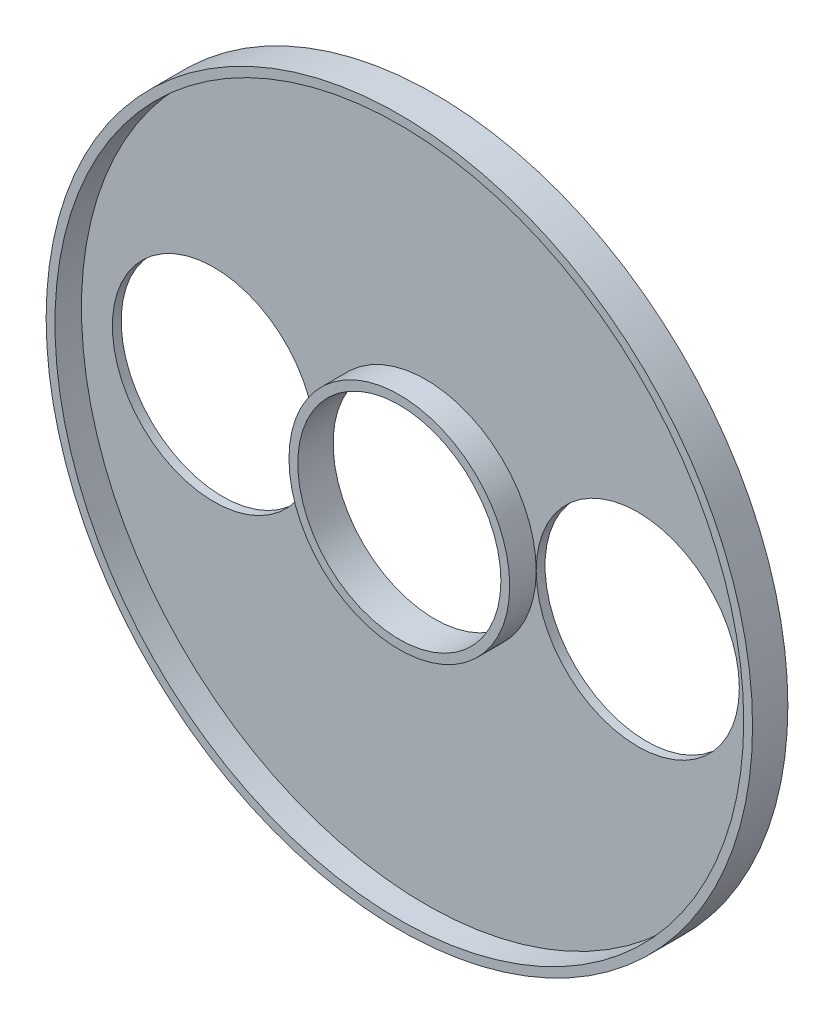
ISO-10303-21;
HEADER;
FILE_DESCRIPTION(('STEP AP214'),'2;1');
FILE_NAME('part.step','',(''),(''),'','','');
FILE_SCHEMA(('AUTOMOTIVE_DESIGN { 1 0 10303 214 1 1 1 1 }'));
ENDSEC;
DATA;
#1=APPLICATION_CONTEXT('core data for automotive mechanical design processes');
#2=APPLICATION_PROTOCOL_DEFINITION('international standard','automotive_design',2000,#1);
#3=PRODUCT_CONTEXT('',#1,'mechanical');
#4=PRODUCT('Part','Part','',(#3));
#5=PRODUCT_RELATED_PRODUCT_CATEGORY('part','',(#4));
#6=PRODUCT_DEFINITION_FORMATION('','',#4);
#7=PRODUCT_DEFINITION_CONTEXT('part definition',#1,'design');
#8=PRODUCT_DEFINITION('design','',#6,#7);
#9=PRODUCT_DEFINITION_SHAPE('','',#8);
#10=(LENGTH_UNIT() NAMED_UNIT(*) SI_UNIT(.MILLI.,.METRE.));
#11=(NAMED_UNIT(*) PLANE_ANGLE_UNIT() SI_UNIT($,.RADIAN.));
#12=(NAMED_UNIT(*) SI_UNIT($,.STERADIAN.) SOLID_ANGLE_UNIT());
#13=UNCERTAINTY_MEASURE_WITH_UNIT(LENGTH_MEASURE(1.E-05),#10,'distance_accuracy_value','');
#14=(GEOMETRIC_REPRESENTATION_CONTEXT(3) GLOBAL_UNCERTAINTY_ASSIGNED_CONTEXT((#13)) GLOBAL_UNIT_ASSIGNED_CONTEXT((#10,
#11,#12)) REPRESENTATION_CONTEXT('',''));
#15=CARTESIAN_POINT('',(0.,0.,0.));
#16=DIRECTION('',(0.,0.,1.));
#17=DIRECTION('',(1.,0.,0.));
#18=AXIS2_PLACEMENT_3D('',#15,#16,#17);
#19=CARTESIAN_POINT('',(0.,0.,-50.));
#20=DIRECTION('',(0.,0.,1.));
#21=DIRECTION('',(1.,0.,0.));
#22=AXIS2_PLACEMENT_3D('',#19,#20,#21);
#23=PLANE('',#22);
#24=CARTESIAN_POINT('',(0.,0.,-50.));
#25=DIRECTION('',(0.,0.,1.));
#26=DIRECTION('',(1.,0.,0.));
#27=AXIS2_PLACEMENT_3D('',#24,#25,#26);
#28=CIRCLE('',#27,78.);
#29=CARTESIAN_POINT('',(78.,0.,-50.));
#30=VERTEX_POINT('',#29);
#31=EDGE_CURVE('E11',#30,#30,#28,.F.);
#32=ORIENTED_EDGE('',*,*,#31,.F.);
#33=EDGE_LOOP('',(#32));
#34=FACE_BOUND('',#33,.T.);
#35=CARTESIAN_POINT('',(0.,0.,-50.));
#36=DIRECTION('',(0.,0.,1.));
#37=DIRECTION('',(1.,0.,0.));
#38=AXIS2_PLACEMENT_3D('',#35,#36,#37);
#39=CIRCLE('',#38,25.);
#40=CARTESIAN_POINT('',(25.,0.,-50.));
#41=VERTEX_POINT('',#40);
#42=CARTESIAN_POINT('',(-25.,0.,-50.));
#43=VERTEX_POINT('',#42);
#44=EDGE_CURVE('E86',#41,#43,#39,.F.);
#45=ORIENTED_EDGE('',*,*,#44,.T.);
#46=CARTESIAN_POINT('',(-48.,0.,-50.));
#47=DIRECTION('',(0.,0.,1.));
#48=DIRECTION('',(1.,0.,0.));
#49=AXIS2_PLACEMENT_3D('',#46,#47,#48);
#50=CIRCLE('',#49,23.);
#51=EDGE_CURVE('E53',#43,#43,#50,.T.);
#52=ORIENTED_EDGE('',*,*,#51,.F.);
#53=EDGE_CURVE('E85',#43,#41,#39,.F.);
#54=ORIENTED_EDGE('',*,*,#53,.T.);
#55=CARTESIAN_POINT('',(48.,0.,-50.));
#56=DIRECTION('',(0.,0.,1.));
#57=DIRECTION('',(1.,0.,0.));
#58=AXIS2_PLACEMENT_3D('',#55,#56,#57);
#59=CIRCLE('',#58,23.);
#60=EDGE_CURVE('E57',#41,#41,#59,.T.);
#61=ORIENTED_EDGE('',*,*,#60,.F.);
#62=EDGE_LOOP('',(#45,#52,#54,#61));
#63=FACE_BOUND('',#62,.T.);
#64=ADVANCED_FACE('F38',(#34,#63),#23,.T.);
#65=CARTESIAN_POINT('',(0.,0.,-52.));
#66=DIRECTION('',(0.,0.,1.));
#67=DIRECTION('',(1.,0.,0.));
#68=AXIS2_PLACEMENT_3D('',#65,#66,#67);
#69=PLANE('',#68);
#70=CARTESIAN_POINT('',(-48.,0.,-52.));
#71=DIRECTION('',(0.,0.,1.));
#72=DIRECTION('',(1.,0.,0.));
#73=AXIS2_PLACEMENT_3D('',#70,#71,#72);
#74=CIRCLE('',#73,23.);
#75=CARTESIAN_POINT('',(-25.,0.,-52.));
#76=VERTEX_POINT('',#75);
#77=EDGE_CURVE('E74',#76,#76,#74,.T.);
#78=ORIENTED_EDGE('',*,*,#77,.T.);
#79=EDGE_LOOP('',(#78));
#80=FACE_BOUND('',#79,.T.);
#81=CARTESIAN_POINT('',(48.,0.,-52.));
#82=DIRECTION('',(0.,0.,1.));
#83=DIRECTION('',(1.,0.,0.));
#84=AXIS2_PLACEMENT_3D('',#81,#82,#83);
#85=CIRCLE('',#84,23.);
#86=CARTESIAN_POINT('',(71.,0.,-52.));
#87=VERTEX_POINT('',#86);
#88=EDGE_CURVE('E64',#87,#87,#85,.T.);
#89=ORIENTED_EDGE('',*,*,#88,.T.);
#90=EDGE_LOOP('',(#89));
#91=FACE_BOUND('',#90,.T.);
#92=CARTESIAN_POINT('',(0.,0.,-52.));
#93=DIRECTION('',(0.,0.,1.));
#94=DIRECTION('',(1.,0.,0.));
#95=AXIS2_PLACEMENT_3D('',#92,#93,#94);
#96=CIRCLE('',#95,23.);
#97=CARTESIAN_POINT('',(23.,0.,-52.));
#98=VERTEX_POINT('',#97);
#99=EDGE_CURVE('E95',#98,#98,#96,.T.);
#100=ORIENTED_EDGE('',*,*,#99,.T.);
#101=EDGE_LOOP('',(#100));
#102=FACE_BOUND('',#101,.T.);
#103=CARTESIAN_POINT('',(0.,0.,-52.));
#104=DIRECTION('',(0.,0.,1.));
#105=DIRECTION('',(1.,0.,0.));
#106=AXIS2_PLACEMENT_3D('',#103,#104,#105);
#107=CIRCLE('',#106,80.);
#108=CARTESIAN_POINT('',(80.,0.,-52.));
#109=VERTEX_POINT('',#108);
#110=EDGE_CURVE('E42',#109,#109,#107,.T.);
#111=ORIENTED_EDGE('',*,*,#110,.F.);
#112=EDGE_LOOP('',(#111));
#113=FACE_BOUND('',#112,.T.);
#114=ADVANCED_FACE('F106',(#80,#91,#102,#113),#69,.F.);
#115=CARTESIAN_POINT('',(0.,0.,-50.));
#116=DIRECTION('',(0.,0.,-1.));
#117=DIRECTION('',(-1.,0.,0.));
#118=AXIS2_PLACEMENT_3D('',#115,#116,#117);
#119=CYLINDRICAL_SURFACE('',#118,80.);
#120=ORIENTED_EDGE('',*,*,#110,.T.);
#121=EDGE_LOOP('',(#120));
#122=FACE_BOUND('',#121,.T.);
#123=CARTESIAN_POINT('',(0.,0.,-44.));
#124=DIRECTION('',(0.,0.,1.));
#125=DIRECTION('',(1.,0.,0.));
#126=AXIS2_PLACEMENT_3D('',#123,#124,#125);
#127=CIRCLE('',#126,80.);
#128=CARTESIAN_POINT('',(80.,0.,-44.));
#129=VERTEX_POINT('',#128);
#130=EDGE_CURVE('E92',#129,#129,#127,.T.);
#131=ORIENTED_EDGE('',*,*,#130,.F.);
#132=EDGE_LOOP('',(#131));
#133=FACE_BOUND('',#132,.T.);
#134=ADVANCED_FACE('F40',(#122,#133),#119,.T.);
#135=CARTESIAN_POINT('',(0.,0.,-50.));
#136=DIRECTION('',(0.,0.,-1.));
#137=DIRECTION('',(-1.,0.,0.));
#138=AXIS2_PLACEMENT_3D('',#135,#136,#137);
#139=CYLINDRICAL_SURFACE('',#138,23.);
#140=ORIENTED_EDGE('',*,*,#99,.F.);
#141=EDGE_LOOP('',(#140));
#142=FACE_BOUND('',#141,.T.);
#143=CARTESIAN_POINT('',(0.,0.,-44.));
#144=DIRECTION('',(0.,0.,1.));
#145=DIRECTION('',(1.,0.,0.));
#146=AXIS2_PLACEMENT_3D('',#143,#144,#145);
#147=CIRCLE('',#146,23.);
#148=CARTESIAN_POINT('',(23.,0.,-44.));
#149=VERTEX_POINT('',#148);
#150=EDGE_CURVE('E77',#149,#149,#147,.T.);
#151=ORIENTED_EDGE('',*,*,#150,.T.);
#152=EDGE_LOOP('',(#151));
#153=FACE_BOUND('',#152,.T.);
#154=ADVANCED_FACE('F113',(#142,#153),#139,.F.);
#155=CARTESIAN_POINT('',(0.,0.,-44.));
#156=DIRECTION('',(0.,0.,1.));
#157=DIRECTION('',(1.,0.,0.));
#158=AXIS2_PLACEMENT_3D('',#155,#156,#157);
#159=PLANE('',#158);
#160=ORIENTED_EDGE('',*,*,#130,.T.);
#161=EDGE_LOOP('',(#160));
#162=FACE_BOUND('',#161,.T.);
#163=CARTESIAN_POINT('',(0.,0.,-44.));
#164=DIRECTION('',(0.,0.,1.));
#165=DIRECTION('',(1.,0.,0.));
#166=AXIS2_PLACEMENT_3D('',#163,#164,#165);
#167=CIRCLE('',#166,78.);
#168=CARTESIAN_POINT('',(78.,0.,-44.));
#169=VERTEX_POINT('',#168);
#170=EDGE_CURVE('E88',#169,#169,#167,.T.);
#171=ORIENTED_EDGE('',*,*,#170,.F.);
#172=EDGE_LOOP('',(#171));
#173=FACE_BOUND('',#172,.T.);
#174=ADVANCED_FACE('F120',(#162,#173),#159,.T.);
#175=CARTESIAN_POINT('',(0.,0.,-44.));
#176=DIRECTION('',(0.,0.,-1.));
#177=DIRECTION('',(-1.,0.,0.));
#178=AXIS2_PLACEMENT_3D('',#175,#176,#177);
#179=CYLINDRICAL_SURFACE('',#178,78.);
#180=ORIENTED_EDGE('',*,*,#31,.T.);
#181=EDGE_LOOP('',(#180));
#182=FACE_BOUND('',#181,.T.);
#183=ORIENTED_EDGE('',*,*,#170,.T.);
#184=EDGE_LOOP('',(#183));
#185=FACE_BOUND('',#184,.T.);
#186=ADVANCED_FACE('F124',(#182,#185),#179,.F.);
#187=CARTESIAN_POINT('',(0.,0.,-44.));
#188=DIRECTION('',(0.,0.,1.));
#189=DIRECTION('',(1.,0.,0.));
#190=AXIS2_PLACEMENT_3D('',#187,#188,#189);
#191=PLANE('',#190);
#192=CARTESIAN_POINT('',(0.,0.,-44.));
#193=DIRECTION('',(0.,0.,1.));
#194=DIRECTION('',(1.,0.,0.));
#195=AXIS2_PLACEMENT_3D('',#192,#193,#194);
#196=CIRCLE('',#195,25.);
#197=CARTESIAN_POINT('',(25.,0.,-44.));
#198=VERTEX_POINT('',#197);
#199=EDGE_CURVE('E81',#198,#198,#196,.T.);
#200=ORIENTED_EDGE('',*,*,#199,.T.);
#201=EDGE_LOOP('',(#200));
#202=FACE_BOUND('',#201,.T.);
#203=ORIENTED_EDGE('',*,*,#150,.F.);
#204=EDGE_LOOP('',(#203));
#205=FACE_BOUND('',#204,.T.);
#206=ADVANCED_FACE('F128',(#202,#205),#191,.T.);
#207=CARTESIAN_POINT('',(0.,0.,-44.));
#208=DIRECTION('',(0.,0.,-1.));
#209=DIRECTION('',(-1.,0.,0.));
#210=AXIS2_PLACEMENT_3D('',#207,#208,#209);
#211=CYLINDRICAL_SURFACE('',#210,25.);
#212=ORIENTED_EDGE('',*,*,#199,.F.);
#213=EDGE_LOOP('',(#212));
#214=FACE_BOUND('',#213,.T.);
#215=ORIENTED_EDGE('',*,*,#53,.F.);
#216=ORIENTED_EDGE('',*,*,#44,.F.);
#217=EDGE_LOOP('',(#215,#216));
#218=FACE_BOUND('',#217,.T.);
#219=ADVANCED_FACE('F130',(#214,#218),#211,.T.);
#220=CARTESIAN_POINT('',(48.,0.,-100.));
#221=DIRECTION('',(0.,0.,1.));
#222=DIRECTION('',(1.,0.,0.));
#223=AXIS2_PLACEMENT_3D('',#220,#221,#222);
#224=CYLINDRICAL_SURFACE('',#223,23.);
#225=ORIENTED_EDGE('',*,*,#60,.T.);
#226=EDGE_LOOP('',(#225));
#227=FACE_BOUND('',#226,.T.);
#228=ORIENTED_EDGE('',*,*,#88,.F.);
#229=EDGE_LOOP('',(#228));
#230=FACE_BOUND('',#229,.T.);
#231=ADVANCED_FACE('F58',(#227,#230),#224,.F.);
#232=CARTESIAN_POINT('',(-48.,0.,-100.));
#233=DIRECTION('',(0.,0.,1.));
#234=DIRECTION('',(1.,0.,0.));
#235=AXIS2_PLACEMENT_3D('',#232,#233,#234);
#236=CYLINDRICAL_SURFACE('',#235,23.);
#237=ORIENTED_EDGE('',*,*,#51,.T.);
#238=EDGE_LOOP('',(#237));
#239=FACE_BOUND('',#238,.T.);
#240=ORIENTED_EDGE('',*,*,#77,.F.);
#241=EDGE_LOOP('',(#240));
#242=FACE_BOUND('',#241,.T.);
#243=ADVANCED_FACE('F139',(#239,#242),#236,.F.);
#244=CLOSED_SHELL('',(#64,#114,#134,#154,#174,#186,#206,#219,#231,#243));
#245=MANIFOLD_SOLID_BREP('B2',#244);
#246=ADVANCED_BREP_SHAPE_REPRESENTATION('',(#18,#245),#14);
#247=SHAPE_DEFINITION_REPRESENTATION(#9,#246);
ENDSEC;
END-ISO-10303-21;
